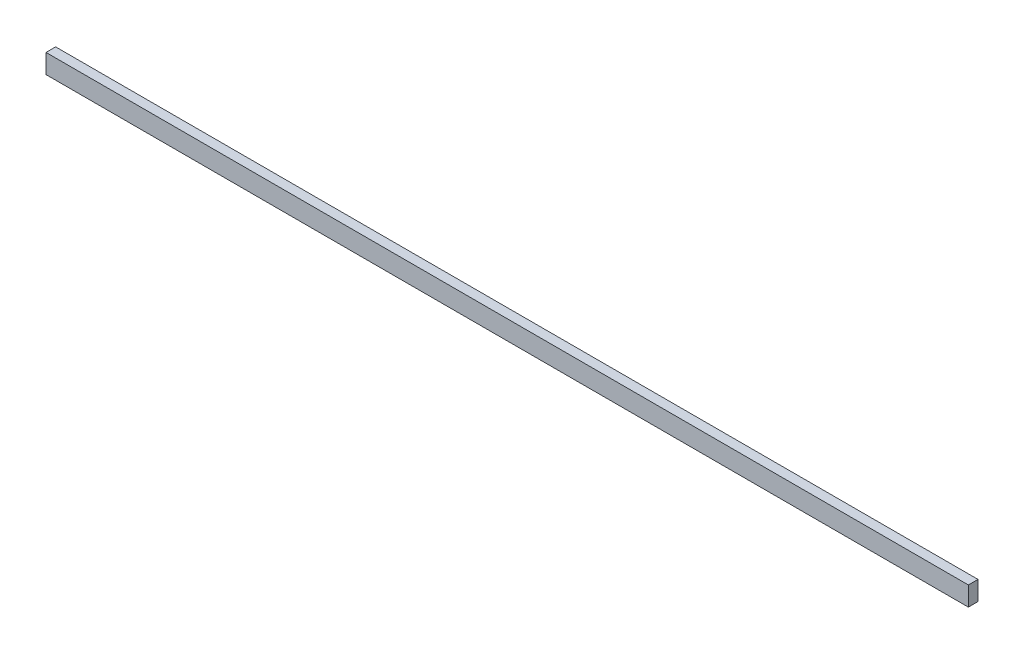
ISO-10303-21;
HEADER;
FILE_DESCRIPTION(('STEP AP214'),'2;1');
FILE_NAME('part.step','',(''),(''),'','','');
FILE_SCHEMA(('AUTOMOTIVE_DESIGN { 1 0 10303 214 1 1 1 1 }'));
ENDSEC;
DATA;
#1=APPLICATION_CONTEXT('core data for automotive mechanical design processes');
#2=APPLICATION_PROTOCOL_DEFINITION('international standard','automotive_design',2000,#1);
#3=PRODUCT_CONTEXT('',#1,'mechanical');
#4=PRODUCT('Part','Part','',(#3));
#5=PRODUCT_RELATED_PRODUCT_CATEGORY('part','',(#4));
#6=PRODUCT_DEFINITION_FORMATION('','',#4);
#7=PRODUCT_DEFINITION_CONTEXT('part definition',#1,'design');
#8=PRODUCT_DEFINITION('design','',#6,#7);
#9=PRODUCT_DEFINITION_SHAPE('','',#8);
#10=(LENGTH_UNIT() NAMED_UNIT(*) SI_UNIT(.MILLI.,.METRE.));
#11=(NAMED_UNIT(*) PLANE_ANGLE_UNIT() SI_UNIT($,.RADIAN.));
#12=(NAMED_UNIT(*) SI_UNIT($,.STERADIAN.) SOLID_ANGLE_UNIT());
#13=UNCERTAINTY_MEASURE_WITH_UNIT(LENGTH_MEASURE(1.E-05),#10,'distance_accuracy_value','');
#14=(GEOMETRIC_REPRESENTATION_CONTEXT(3) GLOBAL_UNCERTAINTY_ASSIGNED_CONTEXT((#13)) GLOBAL_UNIT_ASSIGNED_CONTEXT((#10,
#11,#12)) REPRESENTATION_CONTEXT('',''));
#15=CARTESIAN_POINT('',(0.,0.,0.));
#16=DIRECTION('',(0.,0.,1.));
#17=DIRECTION('',(1.,0.,0.));
#18=AXIS2_PLACEMENT_3D('',#15,#16,#17);
#19=CARTESIAN_POINT('',(228.6,9.525,-2.38759999999999));
#20=DIRECTION('',(-1.,0.,0.));
#21=DIRECTION('',(0.,0.,1.));
#22=AXIS2_PLACEMENT_3D('',#19,#20,#21);
#23=PLANE('',#22);
#24=DIRECTION('',(0.,0.,-1.));
#25=VECTOR('',#24,1.);
#26=CARTESIAN_POINT('',(228.6,0.,-2.38759999999999));
#27=LINE('',#26,#25);
#28=CARTESIAN_POINT('',(228.6,0.,2.38760000000002));
#29=VERTEX_POINT('',#28);
#30=CARTESIAN_POINT('',(228.6,0.,-2.38759999999999));
#31=VERTEX_POINT('',#30);
#32=EDGE_CURVE('E96',#29,#31,#27,.T.);
#33=ORIENTED_EDGE('',*,*,#32,.T.);
#34=DIRECTION('',(0.,-1.,0.));
#35=VECTOR('',#34,1.);
#36=CARTESIAN_POINT('',(228.6,9.525,-2.38759999999999));
#37=LINE('',#36,#35);
#38=CARTESIAN_POINT('',(228.6,9.525,-2.38759999999999));
#39=VERTEX_POINT('',#38);
#40=EDGE_CURVE('E11',#39,#31,#37,.T.);
#41=ORIENTED_EDGE('',*,*,#40,.F.);
#42=DIRECTION('',(0.,0.,-1.));
#43=VECTOR('',#42,1.);
#44=CARTESIAN_POINT('',(228.6,9.525,-2.38759999999999));
#45=LINE('',#44,#43);
#46=CARTESIAN_POINT('',(228.6,9.525,2.38760000000002));
#47=VERTEX_POINT('',#46);
#48=EDGE_CURVE('E84',#47,#39,#45,.T.);
#49=ORIENTED_EDGE('',*,*,#48,.F.);
#50=DIRECTION('',(0.,-1.,0.));
#51=VECTOR('',#50,1.);
#52=CARTESIAN_POINT('',(228.6,9.525,2.38760000000002));
#53=LINE('',#52,#51);
#54=EDGE_CURVE('E92',#47,#29,#53,.T.);
#55=ORIENTED_EDGE('',*,*,#54,.T.);
#56=EDGE_LOOP('',(#33,#41,#49,#55));
#57=FACE_BOUND('',#56,.T.);
#58=ADVANCED_FACE('F33',(#57),#23,.F.);
#59=CARTESIAN_POINT('',(-228.6,9.525,-2.38759999999999));
#60=DIRECTION('',(0.,0.,1.));
#61=DIRECTION('',(1.,0.,0.));
#62=AXIS2_PLACEMENT_3D('',#59,#60,#61);
#63=PLANE('',#62);
#64=DIRECTION('',(-1.,0.,0.));
#65=VECTOR('',#64,1.);
#66=CARTESIAN_POINT('',(-228.6,0.,-2.38759999999999));
#67=LINE('',#66,#65);
#68=CARTESIAN_POINT('',(-228.6,0.,-2.38759999999999));
#69=VERTEX_POINT('',#68);
#70=EDGE_CURVE('E88',#31,#69,#67,.T.);
#71=ORIENTED_EDGE('',*,*,#70,.T.);
#72=DIRECTION('',(0.,-1.,0.));
#73=VECTOR('',#72,1.);
#74=CARTESIAN_POINT('',(-228.6,9.525,-2.38759999999999));
#75=LINE('',#74,#73);
#76=CARTESIAN_POINT('',(-228.6,9.525,-2.38759999999999));
#77=VERTEX_POINT('',#76);
#78=EDGE_CURVE('E41',#77,#69,#75,.T.);
#79=ORIENTED_EDGE('',*,*,#78,.F.);
#80=DIRECTION('',(-1.,0.,0.));
#81=VECTOR('',#80,1.);
#82=CARTESIAN_POINT('',(-228.6,9.525,-2.38759999999999));
#83=LINE('',#82,#81);
#84=EDGE_CURVE('E79',#39,#77,#83,.T.);
#85=ORIENTED_EDGE('',*,*,#84,.F.);
#86=ORIENTED_EDGE('',*,*,#40,.T.);
#87=EDGE_LOOP('',(#71,#79,#85,#86));
#88=FACE_BOUND('',#87,.T.);
#89=ADVANCED_FACE('F87',(#88),#63,.F.);
#90=CARTESIAN_POINT('',(-228.6,9.525,-2.38759999999999));
#91=DIRECTION('',(1.,0.,0.));
#92=DIRECTION('',(0.,0.,-1.));
#93=AXIS2_PLACEMENT_3D('',#90,#91,#92);
#94=PLANE('',#93);
#95=DIRECTION('',(0.,0.,1.));
#96=VECTOR('',#95,1.);
#97=CARTESIAN_POINT('',(-228.6,0.,-2.38759999999999));
#98=LINE('',#97,#96);
#99=CARTESIAN_POINT('',(-228.6,0.,2.38760000000002));
#100=VERTEX_POINT('',#99);
#101=EDGE_CURVE('E66',#69,#100,#98,.T.);
#102=ORIENTED_EDGE('',*,*,#101,.T.);
#103=DIRECTION('',(0.,-1.,0.));
#104=VECTOR('',#103,1.);
#105=CARTESIAN_POINT('',(-228.6,9.525,2.38760000000002));
#106=LINE('',#105,#104);
#107=CARTESIAN_POINT('',(-228.6,9.525,2.38760000000002));
#108=VERTEX_POINT('',#107);
#109=EDGE_CURVE('E89',#108,#100,#106,.T.);
#110=ORIENTED_EDGE('',*,*,#109,.F.);
#111=DIRECTION('',(0.,0.,1.));
#112=VECTOR('',#111,1.);
#113=CARTESIAN_POINT('',(-228.6,9.525,-2.38759999999999));
#114=LINE('',#113,#112);
#115=EDGE_CURVE('E82',#77,#108,#114,.T.);
#116=ORIENTED_EDGE('',*,*,#115,.F.);
#117=ORIENTED_EDGE('',*,*,#78,.T.);
#118=EDGE_LOOP('',(#102,#110,#116,#117));
#119=FACE_BOUND('',#118,.T.);
#120=ADVANCED_FACE('F90',(#119),#94,.F.);
#121=CARTESIAN_POINT('',(-228.6,9.525,2.38760000000002));
#122=DIRECTION('',(0.,0.,-1.));
#123=DIRECTION('',(-1.,0.,0.));
#124=AXIS2_PLACEMENT_3D('',#121,#122,#123);
#125=PLANE('',#124);
#126=DIRECTION('',(1.,0.,0.));
#127=VECTOR('',#126,1.);
#128=CARTESIAN_POINT('',(-228.6,0.,2.38760000000002));
#129=LINE('',#128,#127);
#130=EDGE_CURVE('E72',#100,#29,#129,.T.);
#131=ORIENTED_EDGE('',*,*,#130,.T.);
#132=ORIENTED_EDGE('',*,*,#54,.F.);
#133=DIRECTION('',(1.,0.,0.));
#134=VECTOR('',#133,1.);
#135=CARTESIAN_POINT('',(-228.6,9.525,2.38760000000002));
#136=LINE('',#135,#134);
#137=EDGE_CURVE('E49',#108,#47,#136,.T.);
#138=ORIENTED_EDGE('',*,*,#137,.F.);
#139=ORIENTED_EDGE('',*,*,#109,.T.);
#140=EDGE_LOOP('',(#131,#132,#138,#139));
#141=FACE_BOUND('',#140,.T.);
#142=ADVANCED_FACE('F103',(#141),#125,.F.);
#143=CARTESIAN_POINT('',(0.,9.525,0.));
#144=DIRECTION('',(0.,1.,0.));
#145=DIRECTION('',(0.,0.,1.));
#146=AXIS2_PLACEMENT_3D('',#143,#144,#145);
#147=PLANE('',#146);
#148=ORIENTED_EDGE('',*,*,#48,.T.);
#149=ORIENTED_EDGE('',*,*,#84,.T.);
#150=ORIENTED_EDGE('',*,*,#115,.T.);
#151=ORIENTED_EDGE('',*,*,#137,.T.);
#152=EDGE_LOOP('',(#148,#149,#150,#151));
#153=FACE_BOUND('',#152,.T.);
#154=ADVANCED_FACE('F80',(#153),#147,.T.);
#155=CARTESIAN_POINT('',(0.,0.,0.));
#156=DIRECTION('',(0.,1.,0.));
#157=DIRECTION('',(0.,0.,1.));
#158=AXIS2_PLACEMENT_3D('',#155,#156,#157);
#159=PLANE('',#158);
#160=ORIENTED_EDGE('',*,*,#32,.F.);
#161=ORIENTED_EDGE('',*,*,#130,.F.);
#162=ORIENTED_EDGE('',*,*,#101,.F.);
#163=ORIENTED_EDGE('',*,*,#70,.F.);
#164=EDGE_LOOP('',(#160,#161,#162,#163));
#165=FACE_BOUND('',#164,.T.);
#166=ADVANCED_FACE('F106',(#165),#159,.F.);
#167=CLOSED_SHELL('',(#58,#89,#120,#142,#154,#166));
#168=MANIFOLD_SOLID_BREP('B2',#167);
#169=ADVANCED_BREP_SHAPE_REPRESENTATION('',(#18,#168),#14);
#170=SHAPE_DEFINITION_REPRESENTATION(#9,#169);
ENDSEC;
END-ISO-10303-21;
